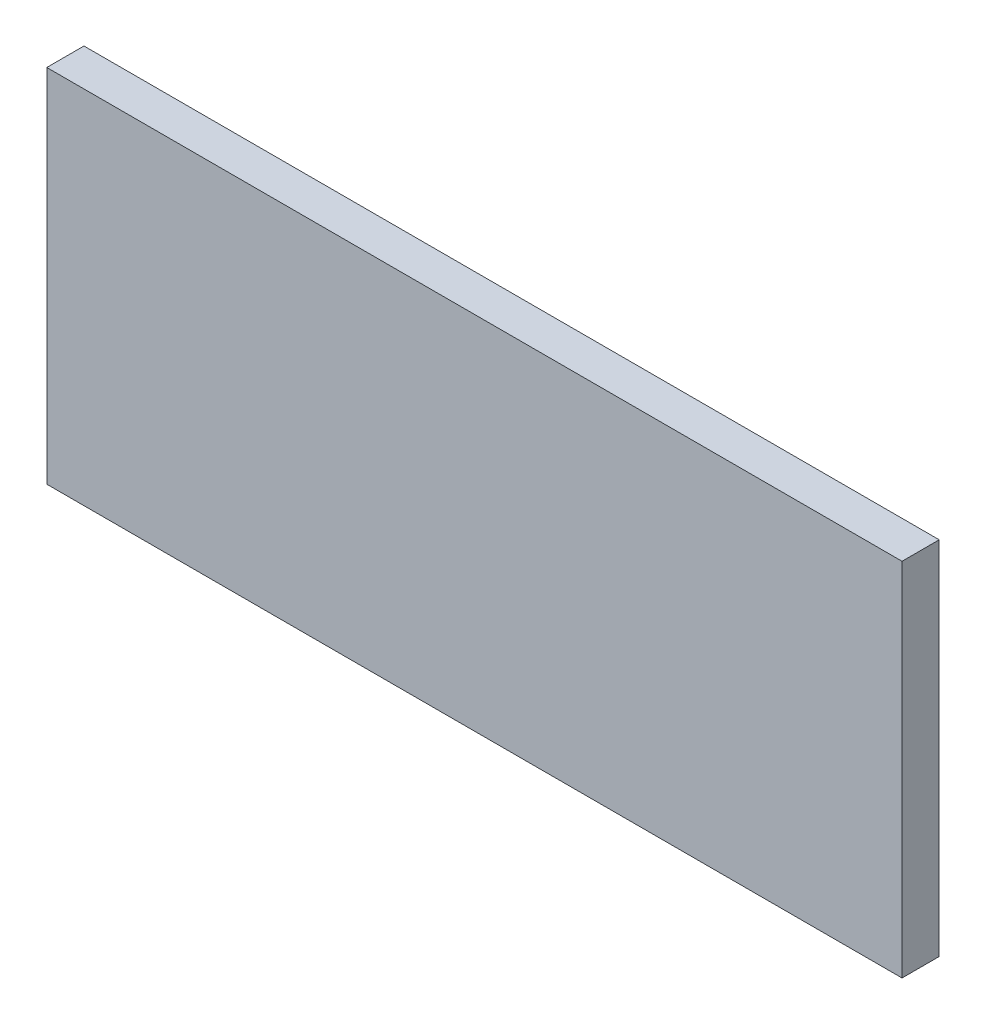
ISO-10303-21;
HEADER;
FILE_DESCRIPTION(('STEP AP214'),'2;1');
FILE_NAME('part.step','',(''),(''),'','','');
FILE_SCHEMA(('AUTOMOTIVE_DESIGN { 1 0 10303 214 1 1 1 1 }'));
ENDSEC;
DATA;
#1=APPLICATION_CONTEXT('core data for automotive mechanical design processes');
#2=APPLICATION_PROTOCOL_DEFINITION('international standard','automotive_design',2000,#1);
#3=PRODUCT_CONTEXT('',#1,'mechanical');
#4=PRODUCT('Part','Part','',(#3));
#5=PRODUCT_RELATED_PRODUCT_CATEGORY('part','',(#4));
#6=PRODUCT_DEFINITION_FORMATION('','',#4);
#7=PRODUCT_DEFINITION_CONTEXT('part definition',#1,'design');
#8=PRODUCT_DEFINITION('design','',#6,#7);
#9=PRODUCT_DEFINITION_SHAPE('','',#8);
#10=(LENGTH_UNIT() NAMED_UNIT(*) SI_UNIT(.MILLI.,.METRE.));
#11=(NAMED_UNIT(*) PLANE_ANGLE_UNIT() SI_UNIT($,.RADIAN.));
#12=(NAMED_UNIT(*) SI_UNIT($,.STERADIAN.) SOLID_ANGLE_UNIT());
#13=UNCERTAINTY_MEASURE_WITH_UNIT(LENGTH_MEASURE(1.E-05),#10,'distance_accuracy_value','');
#14=(GEOMETRIC_REPRESENTATION_CONTEXT(3) GLOBAL_UNCERTAINTY_ASSIGNED_CONTEXT((#13)) GLOBAL_UNIT_ASSIGNED_CONTEXT((#10,
#11,#12)) REPRESENTATION_CONTEXT('',''));
#15=CARTESIAN_POINT('',(0.,0.,0.));
#16=DIRECTION('',(0.,0.,1.));
#17=DIRECTION('',(1.,0.,0.));
#18=AXIS2_PLACEMENT_3D('',#15,#16,#17);
#19=CARTESIAN_POINT('',(-1726.91029900332,381.733588039866,200.));
#20=DIRECTION('',(1.,0.,0.));
#21=DIRECTION('',(0.,1.,0.));
#22=AXIS2_PLACEMENT_3D('',#19,#20,#21);
#23=PLANE('',#22);
#24=DIRECTION('',(0.,-1.,0.));
#25=VECTOR('',#24,1.);
#26=CARTESIAN_POINT('',(-1726.91029900332,381.733588039866,0.));
#27=LINE('',#26,#25);
#28=CARTESIAN_POINT('',(-1726.91029900332,2322.92358803987,0.));
#29=VERTEX_POINT('',#28);
#30=CARTESIAN_POINT('',(-1726.91029900332,381.733588039866,0.));
#31=VERTEX_POINT('',#30);
#32=EDGE_CURVE('E109',#29,#31,#27,.T.);
#33=ORIENTED_EDGE('',*,*,#32,.T.);
#34=DIRECTION('',(0.,0.,-1.));
#35=VECTOR('',#34,1.);
#36=CARTESIAN_POINT('',(-1726.91029900332,381.733588039866,200.));
#37=LINE('',#36,#35);
#38=CARTESIAN_POINT('',(-1726.91029900332,381.733588039866,200.));
#39=VERTEX_POINT('',#38);
#40=EDGE_CURVE('E11',#39,#31,#37,.T.);
#41=ORIENTED_EDGE('',*,*,#40,.F.);
#42=DIRECTION('',(0.,-1.,0.));
#43=VECTOR('',#42,1.);
#44=CARTESIAN_POINT('',(-1726.91029900332,381.733588039866,200.));
#45=LINE('',#44,#43);
#46=CARTESIAN_POINT('',(-1726.91029900332,2322.92358803987,200.));
#47=VERTEX_POINT('',#46);
#48=EDGE_CURVE('E93',#47,#39,#45,.T.);
#49=ORIENTED_EDGE('',*,*,#48,.F.);
#50=DIRECTION('',(0.,0.,-1.));
#51=VECTOR('',#50,1.);
#52=CARTESIAN_POINT('',(-1726.91029900332,2322.92358803987,200.));
#53=LINE('',#52,#51);
#54=EDGE_CURVE('E105',#47,#29,#53,.T.);
#55=ORIENTED_EDGE('',*,*,#54,.T.);
#56=EDGE_LOOP('',(#33,#41,#49,#55));
#57=FACE_BOUND('',#56,.T.);
#58=ADVANCED_FACE('F41',(#57),#23,.F.);
#59=CARTESIAN_POINT('',(2873.08970099668,381.733588039866,200.));
#60=DIRECTION('',(0.,1.,0.));
#61=DIRECTION('',(-1.,0.,0.));
#62=AXIS2_PLACEMENT_3D('',#59,#60,#61);
#63=PLANE('',#62);
#64=DIRECTION('',(1.,0.,0.));
#65=VECTOR('',#64,1.);
#66=CARTESIAN_POINT('',(2873.08970099668,381.733588039866,0.));
#67=LINE('',#66,#65);
#68=CARTESIAN_POINT('',(2873.08970099668,381.733588039866,0.));
#69=VERTEX_POINT('',#68);
#70=EDGE_CURVE('E98',#31,#69,#67,.T.);
#71=ORIENTED_EDGE('',*,*,#70,.T.);
#72=DIRECTION('',(0.,0.,-1.));
#73=VECTOR('',#72,1.);
#74=CARTESIAN_POINT('',(2873.08970099668,381.733588039866,200.));
#75=LINE('',#74,#73);
#76=CARTESIAN_POINT('',(2873.08970099668,381.733588039866,200.));
#77=VERTEX_POINT('',#76);
#78=EDGE_CURVE('E50',#77,#69,#75,.T.);
#79=ORIENTED_EDGE('',*,*,#78,.F.);
#80=DIRECTION('',(1.,0.,0.));
#81=VECTOR('',#80,1.);
#82=CARTESIAN_POINT('',(2873.08970099668,381.733588039866,200.));
#83=LINE('',#82,#81);
#84=EDGE_CURVE('E88',#39,#77,#83,.T.);
#85=ORIENTED_EDGE('',*,*,#84,.F.);
#86=ORIENTED_EDGE('',*,*,#40,.T.);
#87=EDGE_LOOP('',(#71,#79,#85,#86));
#88=FACE_BOUND('',#87,.T.);
#89=ADVANCED_FACE('F97',(#88),#63,.F.);
#90=CARTESIAN_POINT('',(2873.08970099668,2322.92358803987,200.));
#91=DIRECTION('',(-1.,0.,0.));
#92=DIRECTION('',(0.,0.,1.));
#93=AXIS2_PLACEMENT_3D('',#90,#91,#92);
#94=PLANE('',#93);
#95=DIRECTION('',(0.,1.,0.));
#96=VECTOR('',#95,1.);
#97=CARTESIAN_POINT('',(2873.08970099668,2322.92358803987,0.));
#98=LINE('',#97,#96);
#99=CARTESIAN_POINT('',(2873.08970099668,2322.92358803987,0.));
#100=VERTEX_POINT('',#99);
#101=EDGE_CURVE('E75',#69,#100,#98,.T.);
#102=ORIENTED_EDGE('',*,*,#101,.T.);
#103=DIRECTION('',(0.,0.,-1.));
#104=VECTOR('',#103,1.);
#105=CARTESIAN_POINT('',(2873.08970099668,2322.92358803987,200.));
#106=LINE('',#105,#104);
#107=CARTESIAN_POINT('',(2873.08970099668,2322.92358803987,200.));
#108=VERTEX_POINT('',#107);
#109=EDGE_CURVE('E100',#108,#100,#106,.T.);
#110=ORIENTED_EDGE('',*,*,#109,.F.);
#111=DIRECTION('',(0.,1.,0.));
#112=VECTOR('',#111,1.);
#113=CARTESIAN_POINT('',(2873.08970099668,2322.92358803987,200.));
#114=LINE('',#113,#112);
#115=EDGE_CURVE('E91',#77,#108,#114,.T.);
#116=ORIENTED_EDGE('',*,*,#115,.F.);
#117=ORIENTED_EDGE('',*,*,#78,.T.);
#118=EDGE_LOOP('',(#102,#110,#116,#117));
#119=FACE_BOUND('',#118,.T.);
#120=ADVANCED_FACE('F101',(#119),#94,.F.);
#121=CARTESIAN_POINT('',(-1726.91029900332,2322.92358803987,200.));
#122=DIRECTION('',(0.,-1.,0.));
#123=DIRECTION('',(0.,0.,-1.));
#124=AXIS2_PLACEMENT_3D('',#121,#122,#123);
#125=PLANE('',#124);
#126=DIRECTION('',(-1.,0.,0.));
#127=VECTOR('',#126,1.);
#128=CARTESIAN_POINT('',(-1726.91029900332,2322.92358803987,0.));
#129=LINE('',#128,#127);
#130=EDGE_CURVE('E81',#100,#29,#129,.T.);
#131=ORIENTED_EDGE('',*,*,#130,.T.);
#132=ORIENTED_EDGE('',*,*,#54,.F.);
#133=DIRECTION('',(-1.,0.,0.));
#134=VECTOR('',#133,1.);
#135=CARTESIAN_POINT('',(-1726.91029900332,2322.92358803987,200.));
#136=LINE('',#135,#134);
#137=EDGE_CURVE('E58',#108,#47,#136,.T.);
#138=ORIENTED_EDGE('',*,*,#137,.F.);
#139=ORIENTED_EDGE('',*,*,#109,.T.);
#140=EDGE_LOOP('',(#131,#132,#138,#139));
#141=FACE_BOUND('',#140,.T.);
#142=ADVANCED_FACE('F122',(#141),#125,.F.);
#143=CARTESIAN_POINT('',(0.,0.,200.));
#144=DIRECTION('',(0.,0.,-1.));
#145=DIRECTION('',(-1.,0.,0.));
#146=AXIS2_PLACEMENT_3D('',#143,#144,#145);
#147=PLANE('',#146);
#148=ORIENTED_EDGE('',*,*,#48,.T.);
#149=ORIENTED_EDGE('',*,*,#84,.T.);
#150=ORIENTED_EDGE('',*,*,#115,.T.);
#151=ORIENTED_EDGE('',*,*,#137,.T.);
#152=EDGE_LOOP('',(#148,#149,#150,#151));
#153=FACE_BOUND('',#152,.T.);
#154=ADVANCED_FACE('F89',(#153),#147,.F.);
#155=CARTESIAN_POINT('',(0.,0.,0.));
#156=DIRECTION('',(0.,0.,-1.));
#157=DIRECTION('',(-1.,0.,0.));
#158=AXIS2_PLACEMENT_3D('',#155,#156,#157);
#159=PLANE('',#158);
#160=ORIENTED_EDGE('',*,*,#32,.F.);
#161=ORIENTED_EDGE('',*,*,#130,.F.);
#162=ORIENTED_EDGE('',*,*,#101,.F.);
#163=ORIENTED_EDGE('',*,*,#70,.F.);
#164=EDGE_LOOP('',(#160,#161,#162,#163));
#165=FACE_BOUND('',#164,.T.);
#166=ADVANCED_FACE('F125',(#165),#159,.T.);
#167=CLOSED_SHELL('',(#58,#89,#120,#142,#154,#166));
#168=MANIFOLD_SOLID_BREP('B2',#167);
#169=ADVANCED_BREP_SHAPE_REPRESENTATION('',(#18,#168),#14);
#170=SHAPE_DEFINITION_REPRESENTATION(#9,#169);
ENDSEC;
END-ISO-10303-21;
